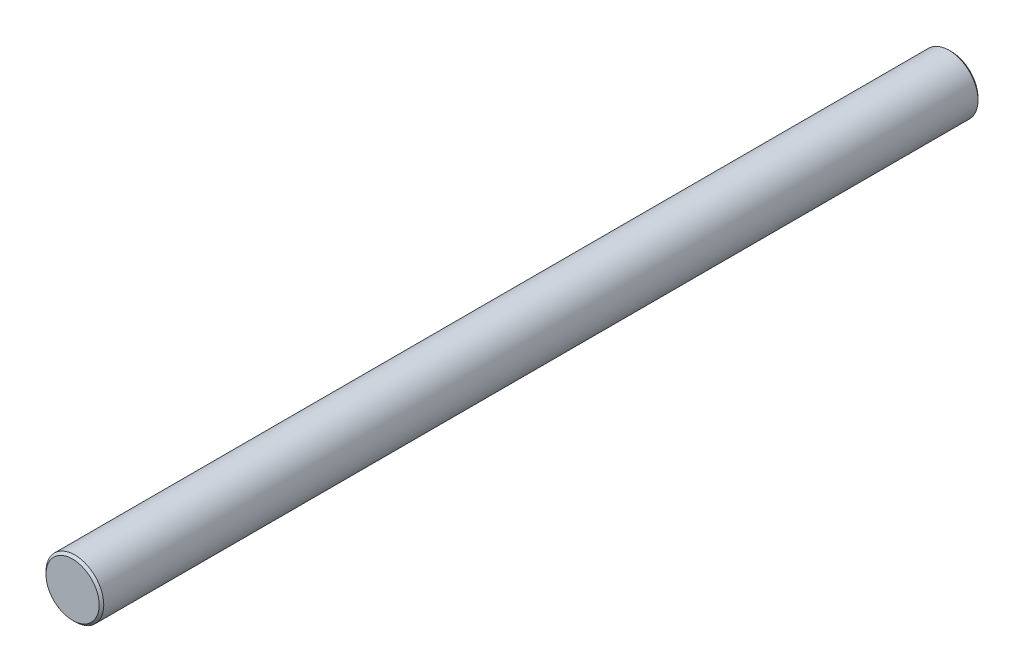
ISO-10303-21;
HEADER;
FILE_DESCRIPTION(('STEP AP214'),'2;1');
FILE_NAME('part.step','',(''),(''),'','','');
FILE_SCHEMA(('AUTOMOTIVE_DESIGN { 1 0 10303 214 1 1 1 1 }'));
ENDSEC;
DATA;
#1=APPLICATION_CONTEXT('core data for automotive mechanical design processes');
#2=APPLICATION_PROTOCOL_DEFINITION('international standard','automotive_design',2000,#1);
#3=PRODUCT_CONTEXT('',#1,'mechanical');
#4=PRODUCT('Part','Part','',(#3));
#5=PRODUCT_RELATED_PRODUCT_CATEGORY('part','',(#4));
#6=PRODUCT_DEFINITION_FORMATION('','',#4);
#7=PRODUCT_DEFINITION_CONTEXT('part definition',#1,'design');
#8=PRODUCT_DEFINITION('design','',#6,#7);
#9=PRODUCT_DEFINITION_SHAPE('','',#8);
#10=(LENGTH_UNIT() NAMED_UNIT(*) SI_UNIT(.MILLI.,.METRE.));
#11=(NAMED_UNIT(*) PLANE_ANGLE_UNIT() SI_UNIT($,.RADIAN.));
#12=(NAMED_UNIT(*) SI_UNIT($,.STERADIAN.) SOLID_ANGLE_UNIT());
#13=UNCERTAINTY_MEASURE_WITH_UNIT(LENGTH_MEASURE(1.E-05),#10,'distance_accuracy_value','');
#14=(GEOMETRIC_REPRESENTATION_CONTEXT(3) GLOBAL_UNCERTAINTY_ASSIGNED_CONTEXT((#13)) GLOBAL_UNIT_ASSIGNED_CONTEXT((#10,
#11,#12)) REPRESENTATION_CONTEXT('',''));
#15=CARTESIAN_POINT('',(0.,0.,0.));
#16=DIRECTION('',(0.,0.,1.));
#17=DIRECTION('',(1.,0.,0.));
#18=AXIS2_PLACEMENT_3D('',#15,#16,#17);
#19=CARTESIAN_POINT('',(0.,2.22044604925031E-13,190.));
#20=DIRECTION('',(0.,0.,-1.));
#21=DIRECTION('',(-1.,0.,0.));
#22=AXIS2_PLACEMENT_3D('',#19,#20,#21);
#23=CYLINDRICAL_SURFACE('',#22,12.5);
#24=CARTESIAN_POINT('',(0.,0.,-189.));
#25=DIRECTION('',(0.,0.,1.));
#26=DIRECTION('',(1.,0.,0.));
#27=AXIS2_PLACEMENT_3D('',#24,#25,#26);
#28=CIRCLE('',#27,12.5);
#29=CARTESIAN_POINT('',(12.5,0.,-189.));
#30=VERTEX_POINT('',#29);
#31=EDGE_CURVE('E56',#30,#30,#28,.T.);
#32=ORIENTED_EDGE('',*,*,#31,.T.);
#33=EDGE_LOOP('',(#32));
#34=FACE_BOUND('',#33,.T.);
#35=CARTESIAN_POINT('',(0.,2.22044604925031E-13,189.));
#36=DIRECTION('',(0.,0.,1.));
#37=DIRECTION('',(1.,0.,0.));
#38=AXIS2_PLACEMENT_3D('',#35,#36,#37);
#39=CIRCLE('',#38,12.5);
#40=CARTESIAN_POINT('',(12.5,2.23432383705813E-13,189.));
#41=VERTEX_POINT('',#40);
#42=EDGE_CURVE('E60',#41,#41,#39,.F.);
#43=ORIENTED_EDGE('',*,*,#42,.T.);
#44=EDGE_LOOP('',(#43));
#45=FACE_BOUND('',#44,.T.);
#46=ADVANCED_FACE('F45',(#34,#45),#23,.T.);
#47=CARTESIAN_POINT('',(0.,2.22044604925031E-13,190.));
#48=DIRECTION('',(0.,0.,1.));
#49=DIRECTION('',(1.,0.,0.));
#50=AXIS2_PLACEMENT_3D('',#47,#48,#49);
#51=PLANE('',#50);
#52=CARTESIAN_POINT('',(0.,2.22044604925031E-13,190.));
#53=DIRECTION('',(0.,0.,1.));
#54=DIRECTION('',(1.,0.,0.));
#55=AXIS2_PLACEMENT_3D('',#52,#53,#54);
#56=CIRCLE('',#55,11.5);
#57=CARTESIAN_POINT('',(11.5,2.2332136140335E-13,190.));
#58=VERTEX_POINT('',#57);
#59=EDGE_CURVE('E12',#58,#58,#56,.T.);
#60=ORIENTED_EDGE('',*,*,#59,.T.);
#61=EDGE_LOOP('',(#60));
#62=FACE_BOUND('',#61,.T.);
#63=ADVANCED_FACE('F76',(#62),#51,.T.);
#64=CARTESIAN_POINT('',(0.,3.33066907387547E-13,-190.));
#65=DIRECTION('',(0.,0.,1.));
#66=DIRECTION('',(1.,0.,0.));
#67=AXIS2_PLACEMENT_3D('',#64,#65,#66);
#68=PLANE('',#67);
#69=CARTESIAN_POINT('',(0.,3.33066907387547E-13,-190.));
#70=DIRECTION('',(0.,0.,1.));
#71=DIRECTION('',(1.,0.,0.));
#72=AXIS2_PLACEMENT_3D('',#69,#70,#71);
#73=CIRCLE('',#72,11.5);
#74=CARTESIAN_POINT('',(11.5,3.34343663865866E-13,-190.));
#75=VERTEX_POINT('',#74);
#76=EDGE_CURVE('E52',#75,#75,#73,.F.);
#77=ORIENTED_EDGE('',*,*,#76,.T.);
#78=EDGE_LOOP('',(#77));
#79=FACE_BOUND('',#78,.T.);
#80=ADVANCED_FACE('F73',(#79),#68,.F.);
#81=CARTESIAN_POINT('',(0.,0.,-189.));
#82=DIRECTION('',(0.,0.,1.));
#83=DIRECTION('',(1.,0.,0.));
#84=AXIS2_PLACEMENT_3D('',#81,#82,#83);
#85=CONICAL_SURFACE('',#84,12.5,0.785398163397443);
#86=ORIENTED_EDGE('',*,*,#76,.F.);
#87=EDGE_LOOP('',(#86));
#88=FACE_BOUND('',#87,.T.);
#89=ORIENTED_EDGE('',*,*,#31,.F.);
#90=EDGE_LOOP('',(#89));
#91=FACE_BOUND('',#90,.T.);
#92=ADVANCED_FACE('F69',(#88,#91),#85,.T.);
#93=CARTESIAN_POINT('',(0.,2.22044604925031E-13,190.));
#94=DIRECTION('',(0.,0.,-1.));
#95=DIRECTION('',(-1.,0.,0.));
#96=AXIS2_PLACEMENT_3D('',#93,#94,#95);
#97=CONICAL_SURFACE('',#96,11.5,0.785398163397457);
#98=ORIENTED_EDGE('',*,*,#42,.F.);
#99=EDGE_LOOP('',(#98));
#100=FACE_BOUND('',#99,.T.);
#101=ORIENTED_EDGE('',*,*,#59,.F.);
#102=EDGE_LOOP('',(#101));
#103=FACE_BOUND('',#102,.T.);
#104=ADVANCED_FACE('F47',(#100,#103),#97,.T.);
#105=CLOSED_SHELL('',(#46,#63,#80,#92,#104));
#106=MANIFOLD_SOLID_BREP('B2',#105);
#107=ADVANCED_BREP_SHAPE_REPRESENTATION('',(#18,#106),#14);
#108=SHAPE_DEFINITION_REPRESENTATION(#9,#107);
ENDSEC;
END-ISO-10303-21;
